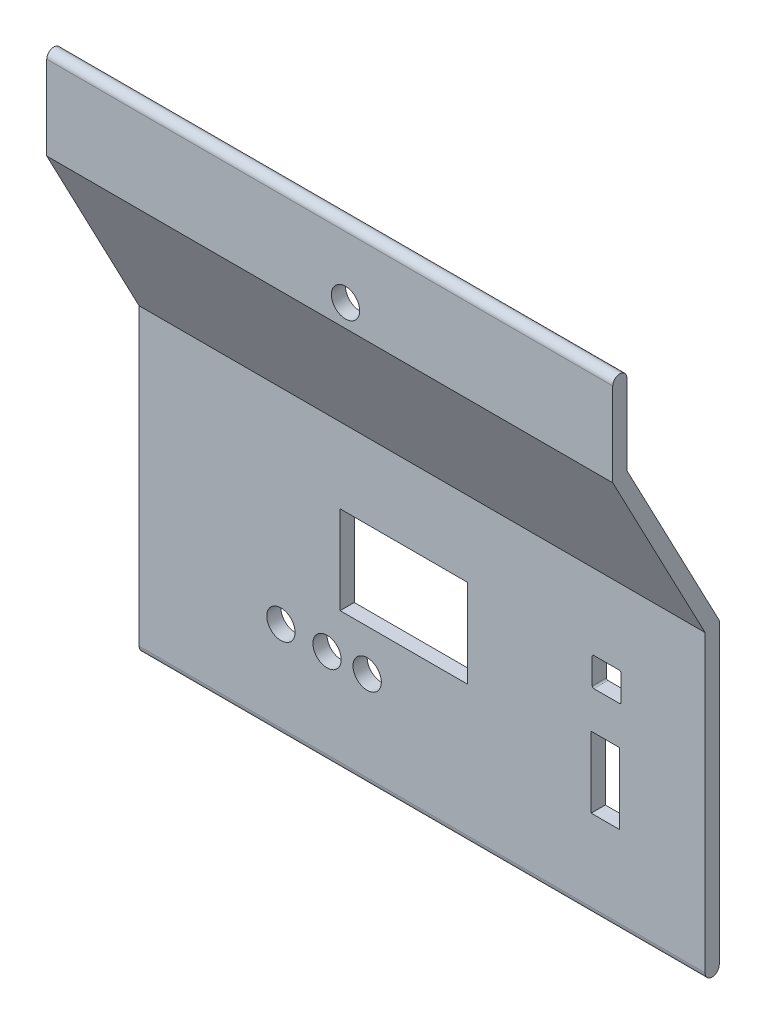
ISO-10303-21;
HEADER;
FILE_DESCRIPTION(('STEP AP214'),'2;1');
FILE_NAME('part.step','',(''),(''),'','','');
FILE_SCHEMA(('AUTOMOTIVE_DESIGN { 1 0 10303 214 1 1 1 1 }'));
ENDSEC;
DATA;
#1=APPLICATION_CONTEXT('core data for automotive mechanical design processes');
#2=APPLICATION_PROTOCOL_DEFINITION('international standard','automotive_design',2000,#1);
#3=PRODUCT_CONTEXT('',#1,'mechanical');
#4=PRODUCT('Part','Part','',(#3));
#5=PRODUCT_RELATED_PRODUCT_CATEGORY('part','',(#4));
#6=PRODUCT_DEFINITION_FORMATION('','',#4);
#7=PRODUCT_DEFINITION_CONTEXT('part definition',#1,'design');
#8=PRODUCT_DEFINITION('design','',#6,#7);
#9=PRODUCT_DEFINITION_SHAPE('','',#8);
#10=(LENGTH_UNIT() NAMED_UNIT(*) SI_UNIT(.MILLI.,.METRE.));
#11=(NAMED_UNIT(*) PLANE_ANGLE_UNIT() SI_UNIT($,.RADIAN.));
#12=(NAMED_UNIT(*) SI_UNIT($,.STERADIAN.) SOLID_ANGLE_UNIT());
#13=UNCERTAINTY_MEASURE_WITH_UNIT(LENGTH_MEASURE(1.E-05),#10,'distance_accuracy_value','');
#14=(GEOMETRIC_REPRESENTATION_CONTEXT(3) GLOBAL_UNCERTAINTY_ASSIGNED_CONTEXT((#13)) GLOBAL_UNIT_ASSIGNED_CONTEXT((#10,
#11,#12)) REPRESENTATION_CONTEXT('',''));
#15=CARTESIAN_POINT('',(0.,0.,0.));
#16=DIRECTION('',(0.,0.,1.));
#17=DIRECTION('',(1.,0.,0.));
#18=AXIS2_PLACEMENT_3D('',#15,#16,#17);
#19=CARTESIAN_POINT('',(-10.,-12.462,-5.53863052366389));
#20=DIRECTION('',(0.,0.,1.));
#21=DIRECTION('',(1.,0.,0.));
#22=AXIS2_PLACEMENT_3D('',#19,#20,#21);
#23=PLANE('',#22);
#24=CARTESIAN_POINT('',(38.3541221797525,6.60391853754038,-5.53863052366389));
#25=DIRECTION('',(0.,0.,1.));
#26=DIRECTION('',(1.,0.,0.));
#27=AXIS2_PLACEMENT_3D('',#24,#25,#26);
#28=CIRCLE('',#27,3.);
#29=CARTESIAN_POINT('',(41.3541221797525,6.60391853754038,-5.53863052366389));
#30=VERTEX_POINT('',#29);
#31=EDGE_CURVE('E402',#30,#30,#28,.T.);
#32=ORIENTED_EDGE('',*,*,#31,.F.);
#33=EDGE_LOOP('',(#32));
#34=FACE_BOUND('',#33,.T.);
#35=CARTESIAN_POINT('',(91.833497894744,33.7056011073311,-5.53863052366389));
#36=DIRECTION('',(0.,0.,1.));
#37=DIRECTION('',(1.,0.,0.));
#38=AXIS2_PLACEMENT_3D('',#35,#36,#37);
#39=CIRCLE('',#38,0.3302);
#40=CARTESIAN_POINT('',(92.163697894744,33.7056011361981,-5.53863052366389));
#41=VERTEX_POINT('',#40);
#42=CARTESIAN_POINT('',(91.833497865877,34.0358011073311,-5.53863052366389));
#43=VERTEX_POINT('',#42);
#44=EDGE_CURVE('E399',#41,#43,#39,.T.);
#45=ORIENTED_EDGE('',*,*,#44,.F.);
#46=DIRECTION('',(-8.7422776559162E-08,0.999999999999996,0.));
#47=VECTOR('',#46,1.);
#48=CARTESIAN_POINT('',(92.1637019308431,-12.4619910685655,-5.53863052366389));
#49=LINE('',#48,#47);
#50=CARTESIAN_POINT('',(92.1636983699393,28.2700011361981,-5.53863052366389));
#51=VERTEX_POINT('',#50);
#52=EDGE_CURVE('E221',#51,#41,#49,.T.);
#53=ORIENTED_EDGE('',*,*,#52,.F.);
#54=CARTESIAN_POINT('',(91.8334983699393,28.2700011073311,-5.53863052366389));
#55=DIRECTION('',(0.,0.,1.));
#56=DIRECTION('',(1.,0.,0.));
#57=AXIS2_PLACEMENT_3D('',#54,#55,#56);
#58=CIRCLE('',#57,0.330200000000004);
#59=CARTESIAN_POINT('',(91.8334983988063,27.9398011073311,-5.53863052366389));
#60=VERTEX_POINT('',#59);
#61=EDGE_CURVE('E394',#60,#51,#58,.T.);
#62=ORIENTED_EDGE('',*,*,#61,.F.);
#63=DIRECTION('',(0.999999999999996,8.74227765591621E-08,0.));
#64=VECTOR('',#63,1.);
#65=CARTESIAN_POINT('',(-10.0000035320369,27.9397922047637,-5.53863052366389));
#66=LINE('',#65,#64);
#67=CARTESIAN_POINT('',(86.3978983988063,27.9398006321359,-5.53863052366389));
#68=VERTEX_POINT('',#67);
#69=EDGE_CURVE('E391',#68,#60,#66,.T.);
#70=ORIENTED_EDGE('',*,*,#69,.F.);
#71=CARTESIAN_POINT('',(86.3978983699393,28.2700006321359,-5.53863052366389));
#72=DIRECTION('',(0.,0.,1.));
#73=DIRECTION('',(1.,0.,0.));
#74=AXIS2_PLACEMENT_3D('',#71,#72,#73);
#75=CIRCLE('',#74,0.330200000000004);
#76=CARTESIAN_POINT('',(86.0676983699393,28.2700006032689,-5.53863052366389));
#77=VERTEX_POINT('',#76);
#78=EDGE_CURVE('E388',#77,#68,#75,.T.);
#79=ORIENTED_EDGE('',*,*,#78,.F.);
#80=DIRECTION('',(8.7422776559162E-08,-0.999999999999996,0.));
#81=VECTOR('',#80,1.);
#82=CARTESIAN_POINT('',(86.0677019308432,-12.4619916014948,-5.53863052366389));
#83=LINE('',#82,#81);
#84=CARTESIAN_POINT('',(86.0676978947441,33.7056006032689,-5.53863052366389));
#85=VERTEX_POINT('',#84);
#86=EDGE_CURVE('E385',#85,#77,#83,.T.);
#87=ORIENTED_EDGE('',*,*,#86,.F.);
#88=CARTESIAN_POINT('',(86.3978978947441,33.7056006321359,-5.53863052366389));
#89=DIRECTION('',(0.,0.,1.));
#90=DIRECTION('',(1.,0.,0.));
#91=AXIS2_PLACEMENT_3D('',#88,#89,#90);
#92=CIRCLE('',#91,0.3302);
#93=CARTESIAN_POINT('',(86.3978978658771,34.0358006321359,-5.53863052366389));
#94=VERTEX_POINT('',#93);
#95=EDGE_CURVE('E382',#94,#85,#92,.T.);
#96=ORIENTED_EDGE('',*,*,#95,.F.);
#97=DIRECTION('',(-0.999999999999996,-8.74227765591621E-08,0.));
#98=VECTOR('',#97,1.);
#99=CARTESIAN_POINT('',(-10.0000040649661,34.0357922047636,-5.53863052366389));
#100=LINE('',#99,#98);
#101=EDGE_CURVE('E379',#43,#94,#100,.T.);
#102=ORIENTED_EDGE('',*,*,#101,.F.);
#103=EDGE_LOOP('',(#45,#53,#62,#70,#79,#87,#96,#102));
#104=FACE_BOUND('',#103,.T.);
#105=DIRECTION('',(0.,-1.,0.));
#106=VECTOR('',#105,1.);
#107=CARTESIAN_POINT('',(32.6209980238357,-12.462,-5.53863052366389));
#108=LINE('',#107,#106);
#109=CARTESIAN_POINT('',(32.6209980238357,34.0670014624339,-5.53863052366389));
#110=VERTEX_POINT('',#109);
#111=CARTESIAN_POINT('',(32.6209980238357,15.3670038228489,-5.53863052366389));
#112=VERTEX_POINT('',#111);
#113=EDGE_CURVE('E376',#110,#112,#108,.T.);
#114=ORIENTED_EDGE('',*,*,#113,.F.);
#115=DIRECTION('',(-0.999999999999996,-8.74227765796438E-08,0.));
#116=VECTOR('',#115,1.);
#117=CARTESIAN_POINT('',(-10.0000040676942,34.0669977363876,-5.53863052366389));
#118=LINE('',#117,#116);
#119=CARTESIAN_POINT('',(59.6209980238356,34.0670038228489,-5.53863052366389));
#120=VERTEX_POINT('',#119);
#121=EDGE_CURVE('E373',#120,#110,#118,.T.);
#122=ORIENTED_EDGE('',*,*,#121,.F.);
#123=DIRECTION('',(-8.74227761332822E-08,0.999999999999996,0.));
#124=VECTOR('',#123,1.);
#125=CARTESIAN_POINT('',(59.6210020915297,-12.4619939135387,-5.53863052366389));
#126=LINE('',#125,#124);
#127=CARTESIAN_POINT('',(59.6209980238356,15.3670038228488,-5.53863052366389));
#128=VERTEX_POINT('',#127);
#129=EDGE_CURVE('E370',#128,#120,#126,.T.);
#130=ORIENTED_EDGE('',*,*,#129,.F.);
#131=DIRECTION('',(1.,0.,0.));
#132=VECTOR('',#131,1.);
#133=CARTESIAN_POINT('',(-9.99999999999991,15.367003822849,-5.53863052366389));
#134=LINE('',#133,#132);
#135=EDGE_CURVE('E367',#112,#128,#134,.T.);
#136=ORIENTED_EDGE('',*,*,#135,.F.);
#137=EDGE_LOOP('',(#114,#122,#130,#136));
#138=FACE_BOUND('',#137,.T.);
#139=CARTESIAN_POINT('',(29.8451214015543,6.47691868249887,-5.53863052366389));
#140=DIRECTION('',(0.,0.,1.));
#141=DIRECTION('',(1.,0.,0.));
#142=AXIS2_PLACEMENT_3D('',#139,#140,#141);
#143=CIRCLE('',#142,3.);
#144=CARTESIAN_POINT('',(32.8451214015543,6.47691868249887,-5.53863052366389));
#145=VERTEX_POINT('',#144);
#146=EDGE_CURVE('E363',#145,#145,#143,.T.);
#147=ORIENTED_EDGE('',*,*,#146,.F.);
#148=EDGE_LOOP('',(#147));
#149=FACE_BOUND('',#148,.T.);
#150=CARTESIAN_POINT('',(20.066122072941,6.60391853754038,-5.53863052366389));
#151=DIRECTION('',(0.,0.,1.));
#152=DIRECTION('',(1.,0.,0.));
#153=AXIS2_PLACEMENT_3D('',#150,#151,#152);
#154=CIRCLE('',#153,3.);
#155=CARTESIAN_POINT('',(23.066122072941,6.60391853754038,-5.53863052366389));
#156=VERTEX_POINT('',#155);
#157=EDGE_CURVE('E359',#156,#156,#154,.T.);
#158=ORIENTED_EDGE('',*,*,#157,.F.);
#159=EDGE_LOOP('',(#158));
#160=FACE_BOUND('',#159,.T.);
#161=DIRECTION('',(1.,0.,0.));
#162=VECTOR('',#161,1.);
#163=CARTESIAN_POINT('',(-10.,-12.462,-5.53863052366389));
#164=LINE('',#163,#162);
#165=CARTESIAN_POINT('',(-10.,-12.462,-5.53863052366389));
#166=VERTEX_POINT('',#165);
#167=CARTESIAN_POINT('',(110.,-12.462,-5.53863052366389));
#168=VERTEX_POINT('',#167);
#169=EDGE_CURVE('E11',#166,#168,#164,.T.);
#170=ORIENTED_EDGE('',*,*,#169,.T.);
#171=DIRECTION('',(0.,-1.,0.));
#172=VECTOR('',#171,1.);
#173=CARTESIAN_POINT('',(110.,-12.462,-5.53863052366389));
#174=LINE('',#173,#172);
#175=CARTESIAN_POINT('',(110.,50.038,-5.53863052366389));
#176=VERTEX_POINT('',#175);
#177=EDGE_CURVE('E434',#176,#168,#174,.T.);
#178=ORIENTED_EDGE('',*,*,#177,.F.);
#179=DIRECTION('',(1.,0.,0.));
#180=VECTOR('',#179,1.);
#181=CARTESIAN_POINT('',(-10.,50.038,-5.53863052366389));
#182=LINE('',#181,#180);
#183=CARTESIAN_POINT('',(-10.,50.038,-5.53863052366389));
#184=VERTEX_POINT('',#183);
#185=EDGE_CURVE('E51',#184,#176,#182,.T.);
#186=ORIENTED_EDGE('',*,*,#185,.F.);
#187=DIRECTION('',(0.,-1.,0.));
#188=VECTOR('',#187,1.);
#189=CARTESIAN_POINT('',(-10.,-12.462,-5.53863052366389));
#190=LINE('',#189,#188);
#191=EDGE_CURVE('E464',#184,#166,#190,.T.);
#192=ORIENTED_EDGE('',*,*,#191,.T.);
#193=EDGE_LOOP('',(#170,#178,#186,#192));
#194=FACE_BOUND('',#193,.T.);
#195=DIRECTION('',(-0.999999999999999,-4.37113885647053E-08,0.));
#196=VECTOR('',#195,1.);
#197=CARTESIAN_POINT('',(-10.0000014119214,19.8389959321867,-5.53863052366389));
#198=LINE('',#197,#196);
#199=CARTESIAN_POINT('',(91.8334983988063,19.8390003834704,-5.53863052366389));
#200=VERTEX_POINT('',#199);
#201=CARTESIAN_POINT('',(85.8460033944349,19.8390001217487,-5.53863052366389));
#202=VERTEX_POINT('',#201);
#203=EDGE_CURVE('E336',#200,#202,#198,.T.);
#204=ORIENTED_EDGE('',*,*,#203,.F.);
#205=DIRECTION('',(0.,-1.,0.));
#206=VECTOR('',#205,1.);
#207=CARTESIAN_POINT('',(91.8334983988063,-12.462,-5.53863052366389));
#208=LINE('',#207,#206);
#209=CARTESIAN_POINT('',(91.8334983988063,4.79900012174872,-5.53863052366389));
#210=VERTEX_POINT('',#209);
#211=EDGE_CURVE('E355',#200,#210,#208,.T.);
#212=ORIENTED_EDGE('',*,*,#211,.T.);
#213=DIRECTION('',(0.999999999999999,4.3711388365544E-08,0.));
#214=VECTOR('',#213,1.);
#215=CARTESIAN_POINT('',(-10.0000007545021,4.79899593218678,-5.53863052366389));
#216=LINE('',#215,#214);
#217=CARTESIAN_POINT('',(85.8460040518542,4.79900012174872,-5.53863052366389));
#218=VERTEX_POINT('',#217);
#219=EDGE_CURVE('E352',#218,#210,#216,.T.);
#220=ORIENTED_EDGE('',*,*,#219,.F.);
#221=DIRECTION('',(4.3711388675316E-08,-0.999999999999999,0.));
#222=VECTOR('',#221,1.);
#223=CARTESIAN_POINT('',(85.8460048063563,-12.461995810438,-5.53863052366389));
#224=LINE('',#223,#222);
#225=EDGE_CURVE('E349',#202,#218,#224,.T.);
#226=ORIENTED_EDGE('',*,*,#225,.F.);
#227=EDGE_LOOP('',(#204,#212,#220,#226));
#228=FACE_BOUND('',#227,.T.);
#229=ADVANCED_FACE('F41',(#34,#104,#138,#149,#160,#194,#228),#23,.T.);
#230=CARTESIAN_POINT('',(-10.,-12.462,-8.53863052366389));
#231=DIRECTION('',(0.,0.,-1.));
#232=DIRECTION('',(-1.,0.,0.));
#233=AXIS2_PLACEMENT_3D('',#230,#231,#232);
#234=PLANE('',#233);
#235=CARTESIAN_POINT('',(38.3541221797525,6.60391853754038,-8.53863052366389));
#236=DIRECTION('',(0.,0.,1.));
#237=DIRECTION('',(1.,0.,0.));
#238=AXIS2_PLACEMENT_3D('',#235,#236,#237);
#239=CIRCLE('',#238,3.);
#240=CARTESIAN_POINT('',(41.3541221797525,6.60391853754038,-8.53863052366389));
#241=VERTEX_POINT('',#240);
#242=EDGE_CURVE('E226',#241,#241,#239,.T.);
#243=ORIENTED_EDGE('',*,*,#242,.T.);
#244=EDGE_LOOP('',(#243));
#245=FACE_BOUND('',#244,.T.);
#246=CARTESIAN_POINT('',(91.833497894744,33.7056011073311,-8.53863052366389));
#247=DIRECTION('',(0.,0.,1.));
#248=DIRECTION('',(1.,0.,0.));
#249=AXIS2_PLACEMENT_3D('',#246,#247,#248);
#250=CIRCLE('',#249,0.3302);
#251=CARTESIAN_POINT('',(92.163697894744,33.7056011361981,-8.53863052366389));
#252=VERTEX_POINT('',#251);
#253=CARTESIAN_POINT('',(91.833497865877,34.0358011073311,-8.53863052366389));
#254=VERTEX_POINT('',#253);
#255=EDGE_CURVE('E229',#252,#254,#250,.T.);
#256=ORIENTED_EDGE('',*,*,#255,.T.);
#257=DIRECTION('',(-0.999999999999996,-8.74227765591621E-08,0.));
#258=VECTOR('',#257,1.);
#259=CARTESIAN_POINT('',(91.833497865877,34.0358011073311,-8.53863052366389));
#260=LINE('',#259,#258);
#261=CARTESIAN_POINT('',(86.3978978658771,34.0358006321359,-8.53863052366389));
#262=VERTEX_POINT('',#261);
#263=EDGE_CURVE('E235',#254,#262,#260,.T.);
#264=ORIENTED_EDGE('',*,*,#263,.T.);
#265=CARTESIAN_POINT('',(86.3978978947441,33.7056006321359,-8.53863052366389));
#266=DIRECTION('',(0.,0.,1.));
#267=DIRECTION('',(1.,0.,0.));
#268=AXIS2_PLACEMENT_3D('',#265,#266,#267);
#269=CIRCLE('',#268,0.3302);
#270=CARTESIAN_POINT('',(86.0676978947441,33.7056006032689,-8.53863052366389));
#271=VERTEX_POINT('',#270);
#272=EDGE_CURVE('E262',#262,#271,#269,.T.);
#273=ORIENTED_EDGE('',*,*,#272,.T.);
#274=DIRECTION('',(8.7422776559162E-08,-0.999999999999996,0.));
#275=VECTOR('',#274,1.);
#276=CARTESIAN_POINT('',(86.0676978947441,33.7056006032689,-8.53863052366389));
#277=LINE('',#276,#275);
#278=CARTESIAN_POINT('',(86.0676983699393,28.2700006032689,-8.53863052366389));
#279=VERTEX_POINT('',#278);
#280=EDGE_CURVE('E258',#271,#279,#277,.T.);
#281=ORIENTED_EDGE('',*,*,#280,.T.);
#282=CARTESIAN_POINT('',(86.3978983699393,28.2700006321359,-8.53863052366389));
#283=DIRECTION('',(0.,0.,1.));
#284=DIRECTION('',(1.,0.,0.));
#285=AXIS2_PLACEMENT_3D('',#282,#283,#284);
#286=CIRCLE('',#285,0.330200000000004);
#287=CARTESIAN_POINT('',(86.3978983988063,27.9398006321359,-8.53863052366389));
#288=VERTEX_POINT('',#287);
#289=EDGE_CURVE('E254',#279,#288,#286,.T.);
#290=ORIENTED_EDGE('',*,*,#289,.T.);
#291=DIRECTION('',(0.999999999999996,8.74227765591621E-08,0.));
#292=VECTOR('',#291,1.);
#293=CARTESIAN_POINT('',(86.3978983988063,27.9398006321359,-8.53863052366389));
#294=LINE('',#293,#292);
#295=CARTESIAN_POINT('',(91.8334983988063,27.9398011073311,-8.53863052366389));
#296=VERTEX_POINT('',#295);
#297=EDGE_CURVE('E246',#288,#296,#294,.T.);
#298=ORIENTED_EDGE('',*,*,#297,.T.);
#299=CARTESIAN_POINT('',(91.8334983699393,28.2700011073311,-8.53863052366389));
#300=DIRECTION('',(0.,0.,1.));
#301=DIRECTION('',(1.,0.,0.));
#302=AXIS2_PLACEMENT_3D('',#299,#300,#301);
#303=CIRCLE('',#302,0.330200000000004);
#304=CARTESIAN_POINT('',(92.1636983699393,28.2700011361981,-8.53863052366389));
#305=VERTEX_POINT('',#304);
#306=EDGE_CURVE('E241',#296,#305,#303,.T.);
#307=ORIENTED_EDGE('',*,*,#306,.T.);
#308=DIRECTION('',(-8.7422776559162E-08,0.999999999999996,0.));
#309=VECTOR('',#308,1.);
#310=CARTESIAN_POINT('',(92.1636983699393,28.2700011361981,-8.53863052366389));
#311=LINE('',#310,#309);
#312=EDGE_CURVE('E218',#305,#252,#311,.T.);
#313=ORIENTED_EDGE('',*,*,#312,.T.);
#314=EDGE_LOOP('',(#256,#264,#273,#281,#290,#298,#307,#313));
#315=FACE_BOUND('',#314,.T.);
#316=DIRECTION('',(0.,-1.,0.));
#317=VECTOR('',#316,1.);
#318=CARTESIAN_POINT('',(32.6209980238357,0.,-8.53863052366389));
#319=LINE('',#318,#317);
#320=CARTESIAN_POINT('',(32.6209990204553,22.667001462434,-8.53863052366389));
#321=VERTEX_POINT('',#320);
#322=CARTESIAN_POINT('',(32.6209980238357,15.3670038228489,-8.53863052366389));
#323=VERTEX_POINT('',#322);
#324=EDGE_CURVE('E276',#321,#323,#319,.T.);
#325=ORIENTED_EDGE('',*,*,#324,.T.);
#326=DIRECTION('',(1.,0.,0.));
#327=VECTOR('',#326,1.);
#328=CARTESIAN_POINT('',(0.,15.367003822849,-8.53863052366389));
#329=LINE('',#328,#327);
#330=CARTESIAN_POINT('',(34.1209996586417,15.3670038228489,-8.53863052366389));
#331=VERTEX_POINT('',#330);
#332=EDGE_CURVE('E309',#323,#331,#329,.T.);
#333=ORIENTED_EDGE('',*,*,#332,.T.);
#334=DIRECTION('',(0.999999999999996,8.74227765245732E-08,0.));
#335=VECTOR('',#334,1.);
#336=CARTESIAN_POINT('',(-1.34342568538927E-06,15.3669986106155,-8.53863052366389));
#337=LINE('',#336,#335);
#338=CARTESIAN_POINT('',(59.6209980238356,15.3670038228488,-8.53863052366389));
#339=VERTEX_POINT('',#338);
#340=EDGE_CURVE('E306',#331,#339,#337,.T.);
#341=ORIENTED_EDGE('',*,*,#340,.T.);
#342=DIRECTION('',(0.,-1.,0.));
#343=VECTOR('',#342,1.);
#344=CARTESIAN_POINT('',(59.6209980238356,0.,-8.53863052366389));
#345=LINE('',#344,#343);
#346=CARTESIAN_POINT('',(59.6209990204552,22.6670038228489,-8.53863052366389));
#347=VERTEX_POINT('',#346);
#348=EDGE_CURVE('E302',#347,#339,#345,.T.);
#349=ORIENTED_EDGE('',*,*,#348,.F.);
#350=DIRECTION('',(-8.74227761332822E-08,0.999999999999996,0.));
#351=VECTOR('',#350,1.);
#352=CARTESIAN_POINT('',(59.6210010020672,5.21223342344593E-06,-8.53863052366389));
#353=LINE('',#352,#351);
#354=CARTESIAN_POINT('',(59.6209980238356,34.0670038228489,-8.53863052366389));
#355=VERTEX_POINT('',#354);
#356=EDGE_CURVE('E298',#347,#355,#353,.T.);
#357=ORIENTED_EDGE('',*,*,#356,.T.);
#358=DIRECTION('',(-0.999999999999996,-8.74227765796438E-08,0.));
#359=VECTOR('',#358,1.);
#360=CARTESIAN_POINT('',(-2.97823160827488E-06,34.0669986106154,-8.53863052366389));
#361=LINE('',#360,#359);
#362=CARTESIAN_POINT('',(32.6209980238357,34.0670014624339,-8.53863052366389));
#363=VERTEX_POINT('',#362);
#364=EDGE_CURVE('E294',#355,#363,#361,.T.);
#365=ORIENTED_EDGE('',*,*,#364,.T.);
#366=DIRECTION('',(8.74227761332822E-08,-0.999999999999996,0.));
#367=VECTOR('',#366,1.);
#368=CARTESIAN_POINT('',(32.6210010020673,2.85181846784731E-06,-8.53863052366389));
#369=LINE('',#368,#367);
#370=EDGE_CURVE('E290',#363,#321,#369,.T.);
#371=ORIENTED_EDGE('',*,*,#370,.T.);
#372=EDGE_LOOP('',(#325,#333,#341,#349,#357,#365,#371));
#373=FACE_BOUND('',#372,.T.);
#374=CARTESIAN_POINT('',(29.8451214015543,6.47691868249887,-8.53863052366389));
#375=DIRECTION('',(0.,0.,1.));
#376=DIRECTION('',(1.,0.,0.));
#377=AXIS2_PLACEMENT_3D('',#374,#375,#376);
#378=CIRCLE('',#377,3.);
#379=CARTESIAN_POINT('',(32.8451214015543,6.47691868249887,-8.53863052366389));
#380=VERTEX_POINT('',#379);
#381=EDGE_CURVE('E271',#380,#380,#378,.T.);
#382=ORIENTED_EDGE('',*,*,#381,.T.);
#383=EDGE_LOOP('',(#382));
#384=FACE_BOUND('',#383,.T.);
#385=CARTESIAN_POINT('',(20.066122072941,6.60391853754038,-8.53863052366389));
#386=DIRECTION('',(0.,0.,1.));
#387=DIRECTION('',(1.,0.,0.));
#388=AXIS2_PLACEMENT_3D('',#385,#386,#387);
#389=CIRCLE('',#388,3.);
#390=CARTESIAN_POINT('',(23.066122072941,6.60391853754038,-8.53863052366389));
#391=VERTEX_POINT('',#390);
#392=EDGE_CURVE('E626',#391,#391,#389,.T.);
#393=ORIENTED_EDGE('',*,*,#392,.T.);
#394=EDGE_LOOP('',(#393));
#395=FACE_BOUND('',#394,.T.);
#396=DIRECTION('',(1.,0.,0.));
#397=VECTOR('',#396,1.);
#398=CARTESIAN_POINT('',(-10.,50.77788024699,-8.53863052366389));
#399=LINE('',#398,#397);
#400=CARTESIAN_POINT('',(-10.,50.77788024699,-8.53863052366389));
#401=VERTEX_POINT('',#400);
#402=CARTESIAN_POINT('',(110.,50.77788024699,-8.53863052366389));
#403=VERTEX_POINT('',#402);
#404=EDGE_CURVE('E483',#401,#403,#399,.T.);
#405=ORIENTED_EDGE('',*,*,#404,.T.);
#406=DIRECTION('',(0.,1.,0.));
#407=VECTOR('',#406,1.);
#408=CARTESIAN_POINT('',(110.,-12.462,-8.53863052366389));
#409=LINE('',#408,#407);
#410=CARTESIAN_POINT('',(110.,-12.462,-8.53863052366389));
#411=VERTEX_POINT('',#410);
#412=EDGE_CURVE('E410',#411,#403,#409,.T.);
#413=ORIENTED_EDGE('',*,*,#412,.F.);
#414=DIRECTION('',(1.,0.,0.));
#415=VECTOR('',#414,1.);
#416=CARTESIAN_POINT('',(-10.,-12.462,-8.53863052366389));
#417=LINE('',#416,#415);
#418=CARTESIAN_POINT('',(-10.,-12.462,-8.53863052366389));
#419=VERTEX_POINT('',#418);
#420=EDGE_CURVE('E467',#419,#411,#417,.T.);
#421=ORIENTED_EDGE('',*,*,#420,.F.);
#422=DIRECTION('',(0.,1.,0.));
#423=VECTOR('',#422,1.);
#424=CARTESIAN_POINT('',(-10.,-12.462,-8.53863052366389));
#425=LINE('',#424,#423);
#426=EDGE_CURVE('E442',#419,#401,#425,.T.);
#427=ORIENTED_EDGE('',*,*,#426,.T.);
#428=EDGE_LOOP('',(#405,#413,#421,#427));
#429=FACE_BOUND('',#428,.T.);
#430=DIRECTION('',(0.999999999999999,4.37113883655439E-08,0.));
#431=VECTOR('',#430,1.);
#432=CARTESIAN_POINT('',(-2.09770794063338E-07,4.79899636930069,-8.53863052366389));
#433=LINE('',#432,#431);
#434=CARTESIAN_POINT('',(85.8460040518542,4.79900012174872,-8.53863052366389));
#435=VERTEX_POINT('',#434);
#436=CARTESIAN_POINT('',(91.8334983988063,4.79900012174872,-8.53863052366389));
#437=VERTEX_POINT('',#436);
#438=EDGE_CURVE('E327',#435,#437,#433,.T.);
#439=ORIENTED_EDGE('',*,*,#438,.T.);
#440=DIRECTION('',(0.,-1.,0.));
#441=VECTOR('',#440,1.);
#442=CARTESIAN_POINT('',(91.8334983988063,0.,-8.53863052366389));
#443=LINE('',#442,#441);
#444=CARTESIAN_POINT('',(91.8334983988063,19.8390001217487,-8.53863052366389));
#445=VERTEX_POINT('',#444);
#446=EDGE_CURVE('E313',#445,#437,#443,.T.);
#447=ORIENTED_EDGE('',*,*,#446,.F.);
#448=DIRECTION('',(-0.999999999999999,-4.37113885647053E-08,0.));
#449=VECTOR('',#448,1.);
#450=CARTESIAN_POINT('',(-8.67190079032279E-07,19.8389963693007,-8.53863052366389));
#451=LINE('',#450,#449);
#452=CARTESIAN_POINT('',(85.8460033944349,19.8390001217487,-8.53863052366389));
#453=VERTEX_POINT('',#452);
#454=EDGE_CURVE('E319',#445,#453,#451,.T.);
#455=ORIENTED_EDGE('',*,*,#454,.T.);
#456=DIRECTION('',(4.3711388675316E-08,-0.999999999999999,0.));
#457=VECTOR('',#456,1.);
#458=CARTESIAN_POINT('',(85.846004261625,3.75244805850272E-06,-8.53863052366389));
#459=LINE('',#458,#457);
#460=EDGE_CURVE('E323',#453,#435,#459,.T.);
#461=ORIENTED_EDGE('',*,*,#460,.T.);
#462=EDGE_LOOP('',(#439,#447,#455,#461));
#463=FACE_BOUND('',#462,.T.);
#464=ADVANCED_FACE('F237',(#245,#315,#373,#384,#395,#429,#463),#234,.T.);
#465=CARTESIAN_POINT('',(-10.,-12.462,-7.03863052366389));
#466=DIRECTION('',(1.,0.,0.));
#467=DIRECTION('',(0.,0.,-1.));
#468=AXIS2_PLACEMENT_3D('',#465,#466,#467);
#469=CYLINDRICAL_SURFACE('',#468,1.5);
#470=ORIENTED_EDGE('',*,*,#420,.T.);
#471=CARTESIAN_POINT('',(110.,-12.462,-7.03863052366389));
#472=DIRECTION('',(1.,0.,0.));
#473=DIRECTION('',(0.,0.,-1.));
#474=AXIS2_PLACEMENT_3D('',#471,#472,#473);
#475=CIRCLE('',#474,1.5);
#476=EDGE_CURVE('E406',#168,#411,#475,.T.);
#477=ORIENTED_EDGE('',*,*,#476,.F.);
#478=ORIENTED_EDGE('',*,*,#169,.F.);
#479=CARTESIAN_POINT('',(-10.,-12.462,-7.03863052366389));
#480=DIRECTION('',(1.,0.,0.));
#481=DIRECTION('',(0.,0.,-1.));
#482=AXIS2_PLACEMENT_3D('',#479,#480,#481);
#483=CIRCLE('',#482,1.5);
#484=EDGE_CURVE('E438',#166,#419,#483,.T.);
#485=ORIENTED_EDGE('',*,*,#484,.T.);
#486=EDGE_LOOP('',(#470,#477,#478,#485));
#487=FACE_BOUND('',#486,.T.);
#488=ADVANCED_FACE('F43',(#487),#469,.T.);
#489=CARTESIAN_POINT('',(-10.,50.038,-5.53863052366389));
#490=DIRECTION('',(0.,-0.464971708521442,0.885325539151928));
#491=DIRECTION('',(0.,-0.885325539151928,-0.464971708521442));
#492=AXIS2_PLACEMENT_3D('',#489,#490,#491);
#493=PLANE('',#492);
#494=ORIENTED_EDGE('',*,*,#185,.T.);
#495=DIRECTION('',(0.,-0.885325539151928,-0.464971708521442));
#496=VECTOR('',#495,1.);
#497=CARTESIAN_POINT('',(110.,50.038,-5.53863052366389));
#498=LINE('',#497,#496);
#499=CARTESIAN_POINT('',(110.,87.3248843412267,14.0443878699875));
#500=VERTEX_POINT('',#499);
#501=EDGE_CURVE('E430',#500,#176,#498,.T.);
#502=ORIENTED_EDGE('',*,*,#501,.F.);
#503=DIRECTION('',(1.,0.,0.));
#504=VECTOR('',#503,1.);
#505=CARTESIAN_POINT('',(-10.,87.3248843412267,14.0443878699875));
#506=LINE('',#505,#504);
#507=CARTESIAN_POINT('',(-10.,87.3248843412267,14.0443878699875));
#508=VERTEX_POINT('',#507);
#509=EDGE_CURVE('E471',#508,#500,#506,.T.);
#510=ORIENTED_EDGE('',*,*,#509,.F.);
#511=DIRECTION('',(0.,-0.885325539151928,-0.464971708521442));
#512=VECTOR('',#511,1.);
#513=CARTESIAN_POINT('',(-10.,50.038,-5.53863052366389));
#514=LINE('',#513,#512);
#515=EDGE_CURVE('E460',#508,#184,#514,.T.);
#516=ORIENTED_EDGE('',*,*,#515,.T.);
#517=EDGE_LOOP('',(#494,#502,#510,#516));
#518=FACE_BOUND('',#517,.T.);
#519=ADVANCED_FACE('F522',(#518),#493,.T.);
#520=CARTESIAN_POINT('',(-10.,87.3248843412267,14.0443878699875));
#521=DIRECTION('',(0.,0.,1.));
#522=DIRECTION('',(1.,0.,0.));
#523=AXIS2_PLACEMENT_3D('',#520,#521,#522);
#524=PLANE('',#523);
#525=CARTESIAN_POINT('',(53.3398780167083,92.075080871582,14.0443878699875));
#526=DIRECTION('',(0.,0.,1.));
#527=DIRECTION('',(1.,0.,0.));
#528=AXIS2_PLACEMENT_3D('',#525,#526,#527);
#529=CIRCLE('',#528,3.);
#530=CARTESIAN_POINT('',(56.3398780167083,92.075080871582,14.0443878699875));
#531=VERTEX_POINT('',#530);
#532=EDGE_CURVE('E234',#531,#531,#529,.T.);
#533=ORIENTED_EDGE('',*,*,#532,.F.);
#534=EDGE_LOOP('',(#533));
#535=FACE_BOUND('',#534,.T.);
#536=ORIENTED_EDGE('',*,*,#509,.T.);
#537=DIRECTION('',(0.,-1.,0.));
#538=VECTOR('',#537,1.);
#539=CARTESIAN_POINT('',(110.,93.6704779982484,14.0443878699875));
#540=LINE('',#539,#538);
#541=CARTESIAN_POINT('',(110.,105.098031759694,14.0443878699875));
#542=VERTEX_POINT('',#541);
#543=EDGE_CURVE('E426',#542,#500,#540,.T.);
#544=ORIENTED_EDGE('',*,*,#543,.F.);
#545=DIRECTION('',(1.,0.,0.));
#546=VECTOR('',#545,1.);
#547=CARTESIAN_POINT('',(-10.,105.098031759694,14.0443878699875));
#548=LINE('',#547,#546);
#549=CARTESIAN_POINT('',(-10.,105.098031759694,14.0443878699875));
#550=VERTEX_POINT('',#549);
#551=EDGE_CURVE('E474',#550,#542,#548,.T.);
#552=ORIENTED_EDGE('',*,*,#551,.F.);
#553=DIRECTION('',(0.,-1.,0.));
#554=VECTOR('',#553,1.);
#555=CARTESIAN_POINT('',(-10.,93.6704779982484,14.0443878699875));
#556=LINE('',#555,#554);
#557=EDGE_CURVE('E457',#550,#508,#556,.T.);
#558=ORIENTED_EDGE('',*,*,#557,.T.);
#559=EDGE_LOOP('',(#536,#544,#552,#558));
#560=FACE_BOUND('',#559,.T.);
#561=ADVANCED_FACE('F519',(#535,#560),#524,.T.);
#562=CARTESIAN_POINT('',(-10.,105.098031759694,12.5443878699875));
#563=DIRECTION('',(1.,0.,0.));
#564=DIRECTION('',(0.,0.,-1.));
#565=AXIS2_PLACEMENT_3D('',#562,#563,#564);
#566=CYLINDRICAL_SURFACE('',#565,1.5);
#567=ORIENTED_EDGE('',*,*,#551,.T.);
#568=CARTESIAN_POINT('',(110.,105.098031759694,12.5443878699875));
#569=DIRECTION('',(1.,0.,0.));
#570=DIRECTION('',(0.,0.,1.));
#571=AXIS2_PLACEMENT_3D('',#568,#569,#570);
#572=CIRCLE('',#571,1.5);
#573=CARTESIAN_POINT('',(110.,105.098031759694,11.0443878699875));
#574=VERTEX_POINT('',#573);
#575=EDGE_CURVE('E422',#574,#542,#572,.T.);
#576=ORIENTED_EDGE('',*,*,#575,.F.);
#577=DIRECTION('',(1.,0.,0.));
#578=VECTOR('',#577,1.);
#579=CARTESIAN_POINT('',(-10.,105.098031759694,11.0443878699875));
#580=LINE('',#579,#578);
#581=CARTESIAN_POINT('',(-10.,105.098031759694,11.0443878699875));
#582=VERTEX_POINT('',#581);
#583=EDGE_CURVE('E477',#582,#574,#580,.T.);
#584=ORIENTED_EDGE('',*,*,#583,.F.);
#585=CARTESIAN_POINT('',(-10.,105.098031759694,12.5443878699875));
#586=DIRECTION('',(1.,0.,0.));
#587=DIRECTION('',(0.,0.,1.));
#588=AXIS2_PLACEMENT_3D('',#585,#586,#587);
#589=CIRCLE('',#588,1.5);
#590=EDGE_CURVE('E453',#582,#550,#589,.T.);
#591=ORIENTED_EDGE('',*,*,#590,.T.);
#592=EDGE_LOOP('',(#567,#576,#584,#591));
#593=FACE_BOUND('',#592,.T.);
#594=ADVANCED_FACE('F515',(#593),#566,.T.);
#595=CARTESIAN_POINT('',(-10.,93.6704779982484,11.0443878699875));
#596=DIRECTION('',(0.,0.,-1.));
#597=DIRECTION('',(-1.,0.,0.));
#598=AXIS2_PLACEMENT_3D('',#595,#596,#597);
#599=PLANE('',#598);
#600=CARTESIAN_POINT('',(53.3398780167083,92.075080871582,11.0443878699875));
#601=DIRECTION('',(0.,0.,-1.));
#602=DIRECTION('',(-1.,0.,0.));
#603=AXIS2_PLACEMENT_3D('',#600,#601,#602);
#604=CIRCLE('',#603,3.);
#605=CARTESIAN_POINT('',(50.3398780167083,92.075080871582,11.0443878699875));
#606=VERTEX_POINT('',#605);
#607=EDGE_CURVE('E45',#606,#606,#604,.T.);
#608=ORIENTED_EDGE('',*,*,#607,.F.);
#609=EDGE_LOOP('',(#608));
#610=FACE_BOUND('',#609,.T.);
#611=ORIENTED_EDGE('',*,*,#583,.T.);
#612=DIRECTION('',(0.,1.,0.));
#613=VECTOR('',#612,1.);
#614=CARTESIAN_POINT('',(110.,88.0647645882167,11.0443878699875));
#615=LINE('',#614,#613);
#616=CARTESIAN_POINT('',(110.,88.0647645882167,11.0443878699875));
#617=VERTEX_POINT('',#616);
#618=EDGE_CURVE('E418',#617,#574,#615,.T.);
#619=ORIENTED_EDGE('',*,*,#618,.F.);
#620=DIRECTION('',(1.,0.,0.));
#621=VECTOR('',#620,1.);
#622=CARTESIAN_POINT('',(-10.,88.0647645882167,11.0443878699875));
#623=LINE('',#622,#621);
#624=CARTESIAN_POINT('',(-10.,88.0647645882167,11.0443878699875));
#625=VERTEX_POINT('',#624);
#626=EDGE_CURVE('E480',#625,#617,#623,.T.);
#627=ORIENTED_EDGE('',*,*,#626,.F.);
#628=DIRECTION('',(0.,1.,0.));
#629=VECTOR('',#628,1.);
#630=CARTESIAN_POINT('',(-10.,88.0647645882167,11.0443878699875));
#631=LINE('',#630,#629);
#632=EDGE_CURVE('E450',#625,#582,#631,.T.);
#633=ORIENTED_EDGE('',*,*,#632,.T.);
#634=EDGE_LOOP('',(#611,#619,#627,#633));
#635=FACE_BOUND('',#634,.T.);
#636=ADVANCED_FACE('F512',(#610,#635),#599,.T.);
#637=CARTESIAN_POINT('',(-10.,50.77788024699,-8.53863052366389));
#638=DIRECTION('',(0.,0.464971708521442,-0.885325539151928));
#639=DIRECTION('',(0.,0.885325539151928,0.464971708521442));
#640=AXIS2_PLACEMENT_3D('',#637,#638,#639);
#641=PLANE('',#640);
#642=ORIENTED_EDGE('',*,*,#626,.T.);
#643=DIRECTION('',(0.,0.885325539151928,0.464971708521442));
#644=VECTOR('',#643,1.);
#645=CARTESIAN_POINT('',(110.,50.77788024699,-8.53863052366389));
#646=LINE('',#645,#644);
#647=EDGE_CURVE('E414',#403,#617,#646,.T.);
#648=ORIENTED_EDGE('',*,*,#647,.F.);
#649=ORIENTED_EDGE('',*,*,#404,.F.);
#650=DIRECTION('',(0.,0.885325539151928,0.464971708521442));
#651=VECTOR('',#650,1.);
#652=CARTESIAN_POINT('',(-10.,50.77788024699,-8.53863052366389));
#653=LINE('',#652,#651);
#654=EDGE_CURVE('E446',#401,#625,#653,.T.);
#655=ORIENTED_EDGE('',*,*,#654,.T.);
#656=EDGE_LOOP('',(#642,#648,#649,#655));
#657=FACE_BOUND('',#656,.T.);
#658=ADVANCED_FACE('F508',(#657),#641,.T.);
#659=CARTESIAN_POINT('',(-10.,-12.462,-7.03863052366389));
#660=DIRECTION('',(1.,0.,0.));
#661=DIRECTION('',(0.,0.,-1.));
#662=AXIS2_PLACEMENT_3D('',#659,#660,#661);
#663=PLANE('',#662);
#664=ORIENTED_EDGE('',*,*,#484,.F.);
#665=ORIENTED_EDGE('',*,*,#191,.F.);
#666=ORIENTED_EDGE('',*,*,#515,.F.);
#667=ORIENTED_EDGE('',*,*,#557,.F.);
#668=ORIENTED_EDGE('',*,*,#590,.F.);
#669=ORIENTED_EDGE('',*,*,#632,.F.);
#670=ORIENTED_EDGE('',*,*,#654,.F.);
#671=ORIENTED_EDGE('',*,*,#426,.F.);
#672=EDGE_LOOP('',(#664,#665,#666,#667,#668,#669,#670,#671));
#673=FACE_BOUND('',#672,.T.);
#674=ADVANCED_FACE('F502',(#673),#663,.F.);
#675=CARTESIAN_POINT('',(110.,-12.462,-7.03863052366389));
#676=DIRECTION('',(1.,0.,0.));
#677=DIRECTION('',(0.,0.,-1.));
#678=AXIS2_PLACEMENT_3D('',#675,#676,#677);
#679=PLANE('',#678);
#680=ORIENTED_EDGE('',*,*,#476,.T.);
#681=ORIENTED_EDGE('',*,*,#412,.T.);
#682=ORIENTED_EDGE('',*,*,#647,.T.);
#683=ORIENTED_EDGE('',*,*,#618,.T.);
#684=ORIENTED_EDGE('',*,*,#575,.T.);
#685=ORIENTED_EDGE('',*,*,#543,.T.);
#686=ORIENTED_EDGE('',*,*,#501,.T.);
#687=ORIENTED_EDGE('',*,*,#177,.T.);
#688=EDGE_LOOP('',(#680,#681,#682,#683,#684,#685,#686,#687));
#689=FACE_BOUND('',#688,.T.);
#690=ADVANCED_FACE('F495',(#689),#679,.T.);
#691=CARTESIAN_POINT('',(91.8334983988063,0.,-8.53863052366389));
#692=DIRECTION('',(-1.,0.,0.));
#693=DIRECTION('',(0.,0.,1.));
#694=AXIS2_PLACEMENT_3D('',#691,#692,#693);
#695=PLANE('',#694);
#696=DIRECTION('',(0.,0.,1.));
#697=VECTOR('',#696,1.);
#698=CARTESIAN_POINT('',(91.8334983988063,19.8390001217487,-8.53863052366389));
#699=LINE('',#698,#697);
#700=EDGE_CURVE('E331',#445,#200,#699,.T.);
#701=ORIENTED_EDGE('',*,*,#700,.F.);
#702=ORIENTED_EDGE('',*,*,#446,.T.);
#703=DIRECTION('',(0.,0.,1.));
#704=VECTOR('',#703,1.);
#705=CARTESIAN_POINT('',(91.8334983988063,4.79900012174872,-8.53863052366389));
#706=LINE('',#705,#704);
#707=EDGE_CURVE('E332',#437,#210,#706,.T.);
#708=ORIENTED_EDGE('',*,*,#707,.T.);
#709=ORIENTED_EDGE('',*,*,#211,.F.);
#710=EDGE_LOOP('',(#701,#702,#708,#709));
#711=FACE_BOUND('',#710,.T.);
#712=ADVANCED_FACE('F545',(#711),#695,.T.);
#713=CARTESIAN_POINT('',(-2.09770794063338E-07,4.79899636930069,-8.53863052366389));
#714=DIRECTION('',(4.37113883655439E-08,-0.999999999999999,0.));
#715=DIRECTION('',(0.999999999999999,4.3711388365544E-08,0.));
#716=AXIS2_PLACEMENT_3D('',#713,#714,#715);
#717=PLANE('',#716);
#718=ORIENTED_EDGE('',*,*,#219,.T.);
#719=ORIENTED_EDGE('',*,*,#707,.F.);
#720=ORIENTED_EDGE('',*,*,#438,.F.);
#721=DIRECTION('',(0.,0.,1.));
#722=VECTOR('',#721,1.);
#723=CARTESIAN_POINT('',(85.8460040518542,4.79900012174872,-8.53863052366389));
#724=LINE('',#723,#722);
#725=EDGE_CURVE('E337',#435,#218,#724,.T.);
#726=ORIENTED_EDGE('',*,*,#725,.T.);
#727=EDGE_LOOP('',(#718,#719,#720,#726));
#728=FACE_BOUND('',#727,.T.);
#729=ADVANCED_FACE('F548',(#728),#717,.F.);
#730=CARTESIAN_POINT('',(85.846004261625,3.75244805850272E-06,-8.53863052366389));
#731=DIRECTION('',(-0.999999999999999,-4.3711388675316E-08,0.));
#732=DIRECTION('',(4.3711388675316E-08,-0.999999999999999,0.));
#733=AXIS2_PLACEMENT_3D('',#730,#731,#732);
#734=PLANE('',#733);
#735=ORIENTED_EDGE('',*,*,#225,.T.);
#736=ORIENTED_EDGE('',*,*,#725,.F.);
#737=ORIENTED_EDGE('',*,*,#460,.F.);
#738=DIRECTION('',(0.,0.,1.));
#739=VECTOR('',#738,1.);
#740=CARTESIAN_POINT('',(85.8460033944349,19.8390001217487,-8.53863052366389));
#741=LINE('',#740,#739);
#742=EDGE_CURVE('E341',#453,#202,#741,.T.);
#743=ORIENTED_EDGE('',*,*,#742,.T.);
#744=EDGE_LOOP('',(#735,#736,#737,#743));
#745=FACE_BOUND('',#744,.T.);
#746=ADVANCED_FACE('F554',(#745),#734,.F.);
#747=CARTESIAN_POINT('',(-8.67190079032279E-07,19.8389963693007,-8.53863052366389));
#748=DIRECTION('',(-4.37113885647053E-08,0.999999999999999,0.));
#749=DIRECTION('',(-0.999999999999999,-4.37113885647053E-08,0.));
#750=AXIS2_PLACEMENT_3D('',#747,#748,#749);
#751=PLANE('',#750);
#752=ORIENTED_EDGE('',*,*,#203,.T.);
#753=ORIENTED_EDGE('',*,*,#742,.F.);
#754=ORIENTED_EDGE('',*,*,#454,.F.);
#755=ORIENTED_EDGE('',*,*,#700,.T.);
#756=EDGE_LOOP('',(#752,#753,#754,#755));
#757=FACE_BOUND('',#756,.T.);
#758=ADVANCED_FACE('F550',(#757),#751,.F.);
#759=CARTESIAN_POINT('',(20.066122072941,6.60391853754038,-8.53863052366389));
#760=DIRECTION('',(0.,0.,1.));
#761=DIRECTION('',(1.,0.,0.));
#762=AXIS2_PLACEMENT_3D('',#759,#760,#761);
#763=CYLINDRICAL_SURFACE('',#762,3.);
#764=ORIENTED_EDGE('',*,*,#157,.T.);
#765=EDGE_LOOP('',(#764));
#766=FACE_BOUND('',#765,.T.);
#767=ORIENTED_EDGE('',*,*,#392,.F.);
#768=EDGE_LOOP('',(#767));
#769=FACE_BOUND('',#768,.T.);
#770=ADVANCED_FACE('F553',(#766,#769),#763,.F.);
#771=CARTESIAN_POINT('',(29.8451214015543,6.47691868249887,-8.53863052366389));
#772=DIRECTION('',(0.,0.,1.));
#773=DIRECTION('',(1.,0.,0.));
#774=AXIS2_PLACEMENT_3D('',#771,#772,#773);
#775=CYLINDRICAL_SURFACE('',#774,3.);
#776=ORIENTED_EDGE('',*,*,#146,.T.);
#777=EDGE_LOOP('',(#776));
#778=FACE_BOUND('',#777,.T.);
#779=ORIENTED_EDGE('',*,*,#381,.F.);
#780=EDGE_LOOP('',(#779));
#781=FACE_BOUND('',#780,.T.);
#782=ADVANCED_FACE('F571',(#778,#781),#775,.F.);
#783=CARTESIAN_POINT('',(32.6209980238357,0.,-8.53863052366389));
#784=DIRECTION('',(-1.,0.,0.));
#785=DIRECTION('',(0.,0.,1.));
#786=AXIS2_PLACEMENT_3D('',#783,#784,#785);
#787=PLANE('',#786);
#788=ORIENTED_EDGE('',*,*,#113,.T.);
#789=DIRECTION('',(0.,0.,1.));
#790=VECTOR('',#789,1.);
#791=CARTESIAN_POINT('',(32.6209980238357,15.3670038228489,-8.53863052366389));
#792=LINE('',#791,#790);
#793=EDGE_CURVE('E67',#323,#112,#792,.T.);
#794=ORIENTED_EDGE('',*,*,#793,.F.);
#795=ORIENTED_EDGE('',*,*,#324,.F.);
#796=ORIENTED_EDGE('',*,*,#370,.F.);
#797=DIRECTION('',(0.,0.,1.));
#798=VECTOR('',#797,1.);
#799=CARTESIAN_POINT('',(32.6209980238357,34.0670014624339,-8.53863052366389));
#800=LINE('',#799,#798);
#801=EDGE_CURVE('E281',#363,#110,#800,.T.);
#802=ORIENTED_EDGE('',*,*,#801,.T.);
#803=EDGE_LOOP('',(#788,#794,#795,#796,#802));
#804=FACE_BOUND('',#803,.T.);
#805=ADVANCED_FACE('F567',(#804),#787,.F.);
#806=CARTESIAN_POINT('',(-2.97823160827488E-06,34.0669986106154,-8.53863052366389));
#807=DIRECTION('',(-8.74227765796437E-08,0.999999999999996,0.));
#808=DIRECTION('',(-0.999999999999996,-8.74227765796438E-08,0.));
#809=AXIS2_PLACEMENT_3D('',#806,#807,#808);
#810=PLANE('',#809);
#811=ORIENTED_EDGE('',*,*,#121,.T.);
#812=ORIENTED_EDGE('',*,*,#801,.F.);
#813=ORIENTED_EDGE('',*,*,#364,.F.);
#814=DIRECTION('',(0.,0.,1.));
#815=VECTOR('',#814,1.);
#816=CARTESIAN_POINT('',(59.6209980238356,34.0670038228489,-8.53863052366389));
#817=LINE('',#816,#815);
#818=EDGE_CURVE('E277',#355,#120,#817,.T.);
#819=ORIENTED_EDGE('',*,*,#818,.T.);
#820=EDGE_LOOP('',(#811,#812,#813,#819));
#821=FACE_BOUND('',#820,.T.);
#822=ADVANCED_FACE('F570',(#821),#810,.F.);
#823=CARTESIAN_POINT('',(59.6210010020672,5.21223342344593E-06,-8.53863052366389));
#824=DIRECTION('',(0.999999999999996,8.74227761332822E-08,0.));
#825=DIRECTION('',(-8.74227761332822E-08,0.999999999999996,0.));
#826=AXIS2_PLACEMENT_3D('',#823,#824,#825);
#827=PLANE('',#826);
#828=ORIENTED_EDGE('',*,*,#129,.T.);
#829=ORIENTED_EDGE('',*,*,#818,.F.);
#830=ORIENTED_EDGE('',*,*,#356,.F.);
#831=ORIENTED_EDGE('',*,*,#348,.T.);
#832=DIRECTION('',(0.,0.,1.));
#833=VECTOR('',#832,1.);
#834=CARTESIAN_POINT('',(59.6209980238356,15.3670038228488,-8.53863052366389));
#835=LINE('',#834,#833);
#836=EDGE_CURVE('E272',#339,#128,#835,.T.);
#837=ORIENTED_EDGE('',*,*,#836,.T.);
#838=EDGE_LOOP('',(#828,#829,#830,#831,#837));
#839=FACE_BOUND('',#838,.T.);
#840=ADVANCED_FACE('F575',(#839),#827,.F.);
#841=CARTESIAN_POINT('',(0.,15.367003822849,-8.53863052366389));
#842=DIRECTION('',(0.,-1.,0.));
#843=DIRECTION('',(1.,0.,0.));
#844=AXIS2_PLACEMENT_3D('',#841,#842,#843);
#845=PLANE('',#844);
#846=ORIENTED_EDGE('',*,*,#135,.T.);
#847=ORIENTED_EDGE('',*,*,#836,.F.);
#848=ORIENTED_EDGE('',*,*,#340,.F.);
#849=ORIENTED_EDGE('',*,*,#332,.F.);
#850=ORIENTED_EDGE('',*,*,#793,.T.);
#851=EDGE_LOOP('',(#846,#847,#848,#849,#850));
#852=FACE_BOUND('',#851,.T.);
#853=ADVANCED_FACE('F579',(#852),#845,.F.);
#854=CARTESIAN_POINT('',(91.833497894744,33.7056011073311,-8.53863052366389));
#855=DIRECTION('',(0.,0.,1.));
#856=DIRECTION('',(1.,0.,0.));
#857=AXIS2_PLACEMENT_3D('',#854,#855,#856);
#858=CYLINDRICAL_SURFACE('',#857,0.3302);
#859=ORIENTED_EDGE('',*,*,#44,.T.);
#860=DIRECTION('',(0.,0.,1.));
#861=VECTOR('',#860,1.);
#862=CARTESIAN_POINT('',(91.833497865877,34.0358011073311,-8.53863052366389));
#863=LINE('',#862,#861);
#864=EDGE_CURVE('E59',#254,#43,#863,.T.);
#865=ORIENTED_EDGE('',*,*,#864,.F.);
#866=ORIENTED_EDGE('',*,*,#255,.F.);
#867=DIRECTION('',(0.,0.,1.));
#868=VECTOR('',#867,1.);
#869=CARTESIAN_POINT('',(92.163697894744,33.7056011361981,-8.53863052366389));
#870=LINE('',#869,#868);
#871=EDGE_CURVE('E213',#252,#41,#870,.T.);
#872=ORIENTED_EDGE('',*,*,#871,.T.);
#873=EDGE_LOOP('',(#859,#865,#866,#872));
#874=FACE_BOUND('',#873,.T.);
#875=ADVANCED_FACE('F230',(#874),#858,.F.);
#876=CARTESIAN_POINT('',(92.1636983699393,28.2700011361981,-8.53863052366389));
#877=DIRECTION('',(0.999999999999996,8.7422776559162E-08,0.));
#878=DIRECTION('',(-8.7422776559162E-08,0.999999999999996,0.));
#879=AXIS2_PLACEMENT_3D('',#876,#877,#878);
#880=PLANE('',#879);
#881=ORIENTED_EDGE('',*,*,#52,.T.);
#882=ORIENTED_EDGE('',*,*,#871,.F.);
#883=ORIENTED_EDGE('',*,*,#312,.F.);
#884=DIRECTION('',(0.,0.,1.));
#885=VECTOR('',#884,1.);
#886=CARTESIAN_POINT('',(92.1636983699393,28.2700011361981,-8.53863052366389));
#887=LINE('',#886,#885);
#888=EDGE_CURVE('E225',#305,#51,#887,.T.);
#889=ORIENTED_EDGE('',*,*,#888,.T.);
#890=EDGE_LOOP('',(#881,#882,#883,#889));
#891=FACE_BOUND('',#890,.T.);
#892=ADVANCED_FACE('F215',(#891),#880,.F.);
#893=CARTESIAN_POINT('',(91.8334983699393,28.2700011073311,-8.53863052366389));
#894=DIRECTION('',(0.,0.,1.));
#895=DIRECTION('',(1.,0.,0.));
#896=AXIS2_PLACEMENT_3D('',#893,#894,#895);
#897=CYLINDRICAL_SURFACE('',#896,0.330200000000004);
#898=ORIENTED_EDGE('',*,*,#61,.T.);
#899=ORIENTED_EDGE('',*,*,#888,.F.);
#900=ORIENTED_EDGE('',*,*,#306,.F.);
#901=DIRECTION('',(0.,0.,1.));
#902=VECTOR('',#901,1.);
#903=CARTESIAN_POINT('',(91.8334983988063,27.9398011073311,-8.53863052366389));
#904=LINE('',#903,#902);
#905=EDGE_CURVE('E647',#296,#60,#904,.T.);
#906=ORIENTED_EDGE('',*,*,#905,.T.);
#907=EDGE_LOOP('',(#898,#899,#900,#906));
#908=FACE_BOUND('',#907,.T.);
#909=ADVANCED_FACE('F589',(#908),#897,.F.);
#910=CARTESIAN_POINT('',(86.3978983988063,27.9398006321359,-8.53863052366389));
#911=DIRECTION('',(8.74227765591621E-08,-0.999999999999996,0.));
#912=DIRECTION('',(0.999999999999996,8.74227765591621E-08,0.));
#913=AXIS2_PLACEMENT_3D('',#910,#911,#912);
#914=PLANE('',#913);
#915=ORIENTED_EDGE('',*,*,#69,.T.);
#916=ORIENTED_EDGE('',*,*,#905,.F.);
#917=ORIENTED_EDGE('',*,*,#297,.F.);
#918=DIRECTION('',(0.,0.,1.));
#919=VECTOR('',#918,1.);
#920=CARTESIAN_POINT('',(86.3978983988063,27.9398006321359,-8.53863052366389));
#921=LINE('',#920,#919);
#922=EDGE_CURVE('E643',#288,#68,#921,.T.);
#923=ORIENTED_EDGE('',*,*,#922,.T.);
#924=EDGE_LOOP('',(#915,#916,#917,#923));
#925=FACE_BOUND('',#924,.T.);
#926=ADVANCED_FACE('F592',(#925),#914,.F.);
#927=CARTESIAN_POINT('',(86.3978983699393,28.2700006321359,-8.53863052366389));
#928=DIRECTION('',(0.,0.,1.));
#929=DIRECTION('',(1.,0.,0.));
#930=AXIS2_PLACEMENT_3D('',#927,#928,#929);
#931=CYLINDRICAL_SURFACE('',#930,0.330200000000004);
#932=ORIENTED_EDGE('',*,*,#78,.T.);
#933=ORIENTED_EDGE('',*,*,#922,.F.);
#934=ORIENTED_EDGE('',*,*,#289,.F.);
#935=DIRECTION('',(0.,0.,1.));
#936=VECTOR('',#935,1.);
#937=CARTESIAN_POINT('',(86.0676983699393,28.2700006032689,-8.53863052366389));
#938=LINE('',#937,#936);
#939=EDGE_CURVE('E639',#279,#77,#938,.T.);
#940=ORIENTED_EDGE('',*,*,#939,.T.);
#941=EDGE_LOOP('',(#932,#933,#934,#940));
#942=FACE_BOUND('',#941,.T.);
#943=ADVANCED_FACE('F596',(#942),#931,.F.);
#944=CARTESIAN_POINT('',(86.0676978947441,33.7056006032689,-8.53863052366389));
#945=DIRECTION('',(-0.999999999999996,-8.7422776559162E-08,0.));
#946=DIRECTION('',(8.7422776559162E-08,-0.999999999999996,0.));
#947=AXIS2_PLACEMENT_3D('',#944,#945,#946);
#948=PLANE('',#947);
#949=ORIENTED_EDGE('',*,*,#86,.T.);
#950=ORIENTED_EDGE('',*,*,#939,.F.);
#951=ORIENTED_EDGE('',*,*,#280,.F.);
#952=DIRECTION('',(0.,0.,1.));
#953=VECTOR('',#952,1.);
#954=CARTESIAN_POINT('',(86.0676978947441,33.7056006032689,-8.53863052366389));
#955=LINE('',#954,#953);
#956=EDGE_CURVE('E635',#271,#85,#955,.T.);
#957=ORIENTED_EDGE('',*,*,#956,.T.);
#958=EDGE_LOOP('',(#949,#950,#951,#957));
#959=FACE_BOUND('',#958,.T.);
#960=ADVANCED_FACE('F600',(#959),#948,.F.);
#961=CARTESIAN_POINT('',(86.3978978947441,33.7056006321359,-8.53863052366389));
#962=DIRECTION('',(0.,0.,1.));
#963=DIRECTION('',(1.,0.,0.));
#964=AXIS2_PLACEMENT_3D('',#961,#962,#963);
#965=CYLINDRICAL_SURFACE('',#964,0.3302);
#966=ORIENTED_EDGE('',*,*,#95,.T.);
#967=ORIENTED_EDGE('',*,*,#956,.F.);
#968=ORIENTED_EDGE('',*,*,#272,.F.);
#969=DIRECTION('',(0.,0.,1.));
#970=VECTOR('',#969,1.);
#971=CARTESIAN_POINT('',(86.3978978658771,34.0358006321359,-8.53863052366389));
#972=LINE('',#971,#970);
#973=EDGE_CURVE('E248',#262,#94,#972,.T.);
#974=ORIENTED_EDGE('',*,*,#973,.T.);
#975=EDGE_LOOP('',(#966,#967,#968,#974));
#976=FACE_BOUND('',#975,.T.);
#977=ADVANCED_FACE('F604',(#976),#965,.F.);
#978=CARTESIAN_POINT('',(91.833497865877,34.0358011073311,-8.53863052366389));
#979=DIRECTION('',(-8.74227765591621E-08,0.999999999999996,0.));
#980=DIRECTION('',(-0.999999999999996,-8.74227765591621E-08,0.));
#981=AXIS2_PLACEMENT_3D('',#978,#979,#980);
#982=PLANE('',#981);
#983=ORIENTED_EDGE('',*,*,#101,.T.);
#984=ORIENTED_EDGE('',*,*,#973,.F.);
#985=ORIENTED_EDGE('',*,*,#263,.F.);
#986=ORIENTED_EDGE('',*,*,#864,.T.);
#987=EDGE_LOOP('',(#983,#984,#985,#986));
#988=FACE_BOUND('',#987,.T.);
#989=ADVANCED_FACE('F585',(#988),#982,.F.);
#990=CARTESIAN_POINT('',(38.3541221797525,6.60391853754038,-8.53863052366389));
#991=DIRECTION('',(0.,0.,1.));
#992=DIRECTION('',(1.,0.,0.));
#993=AXIS2_PLACEMENT_3D('',#990,#991,#992);
#994=CYLINDRICAL_SURFACE('',#993,3.);
#995=ORIENTED_EDGE('',*,*,#31,.T.);
#996=EDGE_LOOP('',(#995));
#997=FACE_BOUND('',#996,.T.);
#998=ORIENTED_EDGE('',*,*,#242,.F.);
#999=EDGE_LOOP('',(#998));
#1000=FACE_BOUND('',#999,.T.);
#1001=ADVANCED_FACE('F565',(#997,#1000),#994,.F.);
#1002=CARTESIAN_POINT('',(53.3398780167083,92.075080871582,-8.53863052366389));
#1003=DIRECTION('',(0.,0.,1.));
#1004=DIRECTION('',(1.,0.,0.));
#1005=AXIS2_PLACEMENT_3D('',#1002,#1003,#1004);
#1006=CYLINDRICAL_SURFACE('',#1005,3.);
#1007=ORIENTED_EDGE('',*,*,#607,.T.);
#1008=EDGE_LOOP('',(#1007));
#1009=FACE_BOUND('',#1008,.T.);
#1010=ORIENTED_EDGE('',*,*,#532,.T.);
#1011=EDGE_LOOP('',(#1010));
#1012=FACE_BOUND('',#1011,.T.);
#1013=ADVANCED_FACE('F562',(#1009,#1012),#1006,.F.);
#1014=CLOSED_SHELL('',(#229,#464,#488,#519,#561,#594,#636,#658,#674,#690,#712,#729,#746,#758,
#770,#782,#805,#822,#840,#853,#875,#892,#909,#926,#943,#960,#977,#989,#1001,#1013));
#1015=MANIFOLD_SOLID_BREP('B2',#1014);
#1016=ADVANCED_BREP_SHAPE_REPRESENTATION('',(#18,#1015),#14);
#1017=SHAPE_DEFINITION_REPRESENTATION(#9,#1016);
ENDSEC;
END-ISO-10303-21;
